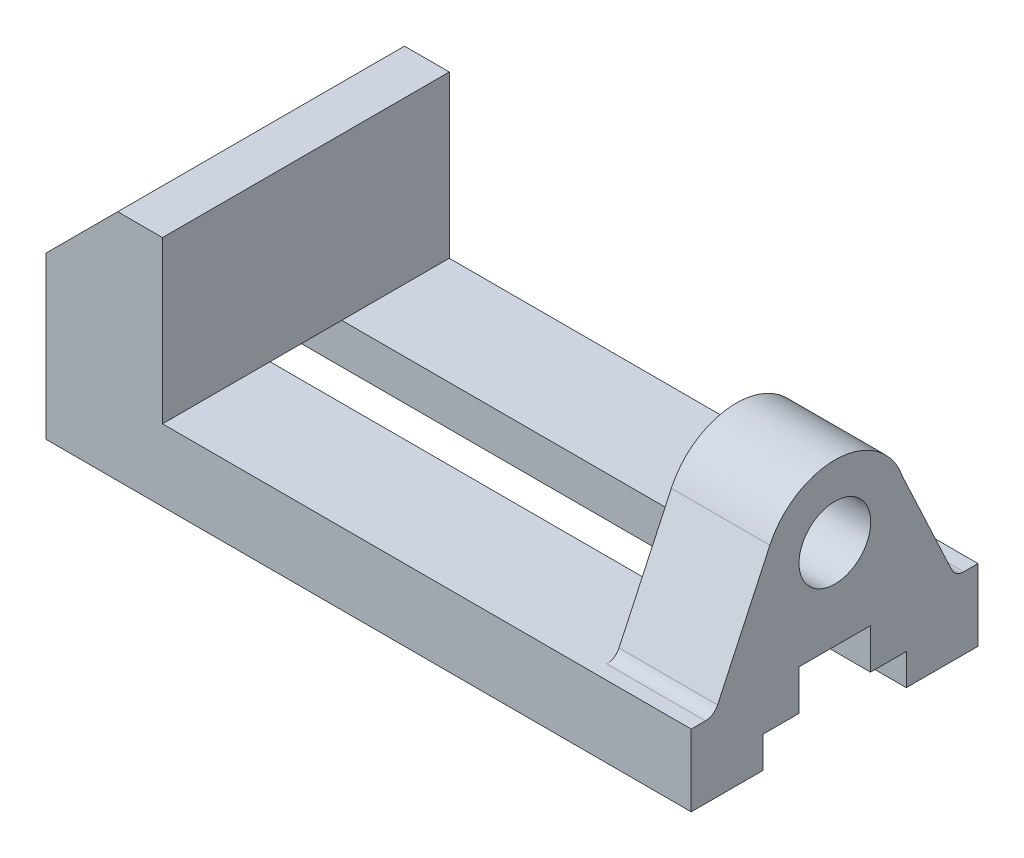
ISO-10303-21;
HEADER;
FILE_DESCRIPTION(('STEP AP214'),'2;1');
FILE_NAME('part.step','',(''),(''),'','','');
FILE_SCHEMA(('AUTOMOTIVE_DESIGN { 1 0 10303 214 1 1 1 1 }'));
ENDSEC;
DATA;
#1=APPLICATION_CONTEXT('core data for automotive mechanical design processes');
#2=APPLICATION_PROTOCOL_DEFINITION('international standard','automotive_design',2000,#1);
#3=PRODUCT_CONTEXT('',#1,'mechanical');
#4=PRODUCT('Part','Part','',(#3));
#5=PRODUCT_RELATED_PRODUCT_CATEGORY('part','',(#4));
#6=PRODUCT_DEFINITION_FORMATION('','',#4);
#7=PRODUCT_DEFINITION_CONTEXT('part definition',#1,'design');
#8=PRODUCT_DEFINITION('design','',#6,#7);
#9=PRODUCT_DEFINITION_SHAPE('','',#8);
#10=(LENGTH_UNIT() NAMED_UNIT(*) SI_UNIT(.MILLI.,.METRE.));
#11=(NAMED_UNIT(*) PLANE_ANGLE_UNIT() SI_UNIT($,.RADIAN.));
#12=(NAMED_UNIT(*) SI_UNIT($,.STERADIAN.) SOLID_ANGLE_UNIT());
#13=UNCERTAINTY_MEASURE_WITH_UNIT(LENGTH_MEASURE(1.E-05),#10,'distance_accuracy_value','');
#14=(GEOMETRIC_REPRESENTATION_CONTEXT(3) GLOBAL_UNCERTAINTY_ASSIGNED_CONTEXT((#13)) GLOBAL_UNIT_ASSIGNED_CONTEXT((#10,
#11,#12)) REPRESENTATION_CONTEXT('',''));
#15=CARTESIAN_POINT('',(0.,0.,0.));
#16=DIRECTION('',(0.,0.,1.));
#17=DIRECTION('',(1.,0.,0.));
#18=AXIS2_PLACEMENT_3D('',#15,#16,#17);
#19=CARTESIAN_POINT('',(26.,16.,32.));
#20=DIRECTION('',(0.,-1.,0.));
#21=DIRECTION('',(1.,0.,0.));
#22=AXIS2_PLACEMENT_3D('',#19,#20,#21);
#23=PLANE('',#22);
#24=DIRECTION('',(0.,0.,1.));
#25=VECTOR('',#24,1.);
#26=CARTESIAN_POINT('',(122.,16.,-26.927127131609));
#27=LINE('',#26,#25);
#28=CARTESIAN_POINT('',(122.,16.,7.99999999999999));
#29=VERTEX_POINT('',#28);
#30=CARTESIAN_POINT('',(122.,16.,28.8383379140315));
#31=VERTEX_POINT('',#30);
#32=EDGE_CURVE('E347',#29,#31,#27,.T.);
#33=ORIENTED_EDGE('',*,*,#32,.F.);
#34=DIRECTION('',(1.,0.,0.));
#35=VECTOR('',#34,1.);
#36=CARTESIAN_POINT('',(0.,16.,8.));
#37=LINE('',#36,#35);
#38=CARTESIAN_POINT('',(26.,16.,8.));
#39=VERTEX_POINT('',#38);
#40=EDGE_CURVE('E67',#39,#29,#37,.T.);
#41=ORIENTED_EDGE('',*,*,#40,.F.);
#42=DIRECTION('',(0.,0.,-1.));
#43=VECTOR('',#42,1.);
#44=CARTESIAN_POINT('',(26.,16.,32.));
#45=LINE('',#44,#43);
#46=CARTESIAN_POINT('',(26.,16.,32.));
#47=VERTEX_POINT('',#46);
#48=EDGE_CURVE('E441',#47,#39,#45,.T.);
#49=ORIENTED_EDGE('',*,*,#48,.F.);
#50=DIRECTION('',(-1.,0.,0.));
#51=VECTOR('',#50,1.);
#52=CARTESIAN_POINT('',(26.,16.,32.));
#53=LINE('',#52,#51);
#54=CARTESIAN_POINT('',(144.,16.,32.));
#55=VERTEX_POINT('',#54);
#56=EDGE_CURVE('E385',#55,#47,#53,.T.);
#57=ORIENTED_EDGE('',*,*,#56,.F.);
#58=DIRECTION('',(0.,0.,-1.));
#59=VECTOR('',#58,1.);
#60=CARTESIAN_POINT('',(144.,16.,32.));
#61=LINE('',#60,#59);
#62=CARTESIAN_POINT('',(144.,16.,28.8383379140315));
#63=VERTEX_POINT('',#62);
#64=EDGE_CURVE('E446',#55,#63,#61,.T.);
#65=ORIENTED_EDGE('',*,*,#64,.T.);
#66=DIRECTION('',(1.,0.,0.));
#67=VECTOR('',#66,1.);
#68=CARTESIAN_POINT('',(122.,16.,28.8383379140315));
#69=LINE('',#68,#67);
#70=EDGE_CURVE('E459',#63,#31,#69,.F.);
#71=ORIENTED_EDGE('',*,*,#70,.T.);
#72=EDGE_LOOP('',(#33,#41,#49,#57,#65,#71));
#73=FACE_BOUND('',#72,.T.);
#74=ADVANCED_FACE('F43',(#73),#23,.F.);
#75=CARTESIAN_POINT('',(144.,0.,32.));
#76=DIRECTION('',(0.,1.,0.));
#77=DIRECTION('',(-1.,0.,0.));
#78=AXIS2_PLACEMENT_3D('',#75,#76,#77);
#79=PLANE('',#78);
#80=CARTESIAN_POINT('',(36.,0.,22.));
#81=DIRECTION('',(0.,-1.,0.));
#82=DIRECTION('',(0.,0.,-1.));
#83=AXIS2_PLACEMENT_3D('',#80,#81,#82);
#84=CIRCLE('',#83,2.99999999999999);
#85=CARTESIAN_POINT('',(36.,0.,19.));
#86=VERTEX_POINT('',#85);
#87=EDGE_CURVE('E222',#86,#86,#84,.T.);
#88=ORIENTED_EDGE('',*,*,#87,.F.);
#89=EDGE_LOOP('',(#88));
#90=FACE_BOUND('',#89,.T.);
#91=CARTESIAN_POINT('',(106.,0.,22.));
#92=DIRECTION('',(0.,-1.,0.));
#93=DIRECTION('',(0.,0.,-1.));
#94=AXIS2_PLACEMENT_3D('',#91,#92,#93);
#95=CIRCLE('',#94,2.99999999999999);
#96=CARTESIAN_POINT('',(106.,0.,19.));
#97=VERTEX_POINT('',#96);
#98=EDGE_CURVE('E244',#97,#97,#95,.T.);
#99=ORIENTED_EDGE('',*,*,#98,.F.);
#100=EDGE_LOOP('',(#99));
#101=FACE_BOUND('',#100,.T.);
#102=DIRECTION('',(0.,0.,-1.));
#103=VECTOR('',#102,1.);
#104=CARTESIAN_POINT('',(0.,0.,32.));
#105=LINE('',#104,#103);
#106=CARTESIAN_POINT('',(0.,0.,32.));
#107=VERTEX_POINT('',#106);
#108=CARTESIAN_POINT('',(0.,0.,16.));
#109=VERTEX_POINT('',#108);
#110=EDGE_CURVE('E424',#107,#109,#105,.T.);
#111=ORIENTED_EDGE('',*,*,#110,.T.);
#112=DIRECTION('',(1.,0.,0.));
#113=VECTOR('',#112,1.);
#114=CARTESIAN_POINT('',(144.,0.,16.));
#115=LINE('',#114,#113);
#116=CARTESIAN_POINT('',(144.,0.,16.));
#117=VERTEX_POINT('',#116);
#118=EDGE_CURVE('E330',#109,#117,#115,.T.);
#119=ORIENTED_EDGE('',*,*,#118,.T.);
#120=DIRECTION('',(0.,0.,-1.));
#121=VECTOR('',#120,1.);
#122=CARTESIAN_POINT('',(144.,0.,32.));
#123=LINE('',#122,#121);
#124=CARTESIAN_POINT('',(144.,0.,32.));
#125=VERTEX_POINT('',#124);
#126=EDGE_CURVE('E451',#125,#117,#123,.T.);
#127=ORIENTED_EDGE('',*,*,#126,.F.);
#128=DIRECTION('',(1.,0.,0.));
#129=VECTOR('',#128,1.);
#130=CARTESIAN_POINT('',(144.,0.,32.));
#131=LINE('',#130,#129);
#132=EDGE_CURVE('E377',#107,#125,#131,.T.);
#133=ORIENTED_EDGE('',*,*,#132,.F.);
#134=EDGE_LOOP('',(#111,#119,#127,#133));
#135=FACE_BOUND('',#134,.T.);
#136=ADVANCED_FACE('F547',(#90,#101,#135),#79,.F.);
#137=CARTESIAN_POINT('',(26.,16.,-8.));
#138=VERTEX_POINT('',#137);
#139=CARTESIAN_POINT('',(26.,16.,-32.));
#140=VERTEX_POINT('',#139);
#141=EDGE_CURVE('E440',#138,#140,#45,.T.);
#142=ORIENTED_EDGE('',*,*,#141,.F.);
#143=DIRECTION('',(1.,0.,0.));
#144=VECTOR('',#143,1.);
#145=CARTESIAN_POINT('',(0.,16.,-8.));
#146=LINE('',#145,#144);
#147=CARTESIAN_POINT('',(122.,16.,-8.));
#148=VERTEX_POINT('',#147);
#149=EDGE_CURVE('E316',#138,#148,#146,.T.);
#150=ORIENTED_EDGE('',*,*,#149,.T.);
#151=CARTESIAN_POINT('',(122.,16.,-28.8383379140315));
#152=VERTEX_POINT('',#151);
#153=EDGE_CURVE('E349',#152,#148,#27,.T.);
#154=ORIENTED_EDGE('',*,*,#153,.F.);
#155=DIRECTION('',(1.,0.,0.));
#156=VECTOR('',#155,1.);
#157=CARTESIAN_POINT('',(144.,16.,-28.8383379140315));
#158=LINE('',#157,#156);
#159=CARTESIAN_POINT('',(144.,16.,-28.8383379140315));
#160=VERTEX_POINT('',#159);
#161=EDGE_CURVE('E469',#152,#160,#158,.T.);
#162=ORIENTED_EDGE('',*,*,#161,.T.);
#163=CARTESIAN_POINT('',(144.,16.,-32.));
#164=VERTEX_POINT('',#163);
#165=EDGE_CURVE('E445',#160,#164,#61,.T.);
#166=ORIENTED_EDGE('',*,*,#165,.T.);
#167=DIRECTION('',(-1.,0.,0.));
#168=VECTOR('',#167,1.);
#169=CARTESIAN_POINT('',(26.,16.,-32.));
#170=LINE('',#169,#168);
#171=EDGE_CURVE('E408',#164,#140,#170,.T.);
#172=ORIENTED_EDGE('',*,*,#171,.T.);
#173=EDGE_LOOP('',(#142,#150,#154,#162,#166,#172));
#174=FACE_BOUND('',#173,.T.);
#175=ADVANCED_FACE('F491',(#174),#23,.F.);
#176=CARTESIAN_POINT('',(36.,0.,-22.));
#177=DIRECTION('',(0.,-1.,0.));
#178=DIRECTION('',(0.,0.,-1.));
#179=AXIS2_PLACEMENT_3D('',#176,#177,#178);
#180=CIRCLE('',#179,2.99999999999999);
#181=CARTESIAN_POINT('',(36.,0.,-25.));
#182=VERTEX_POINT('',#181);
#183=EDGE_CURVE('E223',#182,#182,#180,.T.);
#184=ORIENTED_EDGE('',*,*,#183,.F.);
#185=EDGE_LOOP('',(#184));
#186=FACE_BOUND('',#185,.T.);
#187=CARTESIAN_POINT('',(106.,0.,-22.));
#188=DIRECTION('',(0.,-1.,0.));
#189=DIRECTION('',(0.,0.,-1.));
#190=AXIS2_PLACEMENT_3D('',#187,#188,#189);
#191=CIRCLE('',#190,2.99999999999999);
#192=CARTESIAN_POINT('',(106.,0.,-25.));
#193=VERTEX_POINT('',#192);
#194=EDGE_CURVE('E236',#193,#193,#191,.T.);
#195=ORIENTED_EDGE('',*,*,#194,.F.);
#196=EDGE_LOOP('',(#195));
#197=FACE_BOUND('',#196,.T.);
#198=CARTESIAN_POINT('',(144.,0.,-16.));
#199=VERTEX_POINT('',#198);
#200=CARTESIAN_POINT('',(144.,0.,-32.));
#201=VERTEX_POINT('',#200);
#202=EDGE_CURVE('E450',#199,#201,#123,.T.);
#203=ORIENTED_EDGE('',*,*,#202,.F.);
#204=DIRECTION('',(-1.,0.,0.));
#205=VECTOR('',#204,1.);
#206=CARTESIAN_POINT('',(144.,0.,-16.));
#207=LINE('',#206,#205);
#208=CARTESIAN_POINT('',(0.,0.,-16.));
#209=VERTEX_POINT('',#208);
#210=EDGE_CURVE('E326',#199,#209,#207,.T.);
#211=ORIENTED_EDGE('',*,*,#210,.T.);
#212=CARTESIAN_POINT('',(0.,0.,-32.));
#213=VERTEX_POINT('',#212);
#214=EDGE_CURVE('E400',#209,#213,#105,.T.);
#215=ORIENTED_EDGE('',*,*,#214,.T.);
#216=DIRECTION('',(1.,0.,0.));
#217=VECTOR('',#216,1.);
#218=CARTESIAN_POINT('',(144.,0.,-32.));
#219=LINE('',#218,#217);
#220=EDGE_CURVE('E376',#213,#201,#219,.T.);
#221=ORIENTED_EDGE('',*,*,#220,.T.);
#222=EDGE_LOOP('',(#203,#211,#215,#221));
#223=FACE_BOUND('',#222,.T.);
#224=ADVANCED_FACE('F576',(#186,#197,#223),#79,.F.);
#225=CARTESIAN_POINT('',(144.,16.,32.));
#226=DIRECTION('',(-1.,0.,0.));
#227=DIRECTION('',(0.,0.,1.));
#228=AXIS2_PLACEMENT_3D('',#225,#226,#227);
#229=PLANE('',#228);
#230=CARTESIAN_POINT('',(144.,36.,-0.0530727348907658));
#231=DIRECTION('',(1.,0.,0.));
#232=DIRECTION('',(0.,0.,-1.));
#233=AXIS2_PLACEMENT_3D('',#230,#231,#232);
#234=CIRCLE('',#233,8.);
#235=CARTESIAN_POINT('',(144.,36.,-8.05307273489077));
#236=VERTEX_POINT('',#235);
#237=EDGE_CURVE('E334',#236,#236,#234,.T.);
#238=ORIENTED_EDGE('',*,*,#237,.F.);
#239=EDGE_LOOP('',(#238));
#240=FACE_BOUND('',#239,.T.);
#241=ORIENTED_EDGE('',*,*,#126,.T.);
#242=DIRECTION('',(0.,-1.,0.));
#243=VECTOR('',#242,1.);
#244=CARTESIAN_POINT('',(144.,-7.59312526247733,16.));
#245=LINE('',#244,#243);
#246=CARTESIAN_POINT('',(144.,7.,16.));
#247=VERTEX_POINT('',#246);
#248=EDGE_CURVE('E256',#247,#117,#245,.T.);
#249=ORIENTED_EDGE('',*,*,#248,.F.);
#250=DIRECTION('',(0.,0.,1.));
#251=VECTOR('',#250,1.);
#252=CARTESIAN_POINT('',(144.,7.,16.));
#253=LINE('',#252,#251);
#254=CARTESIAN_POINT('',(144.,7.,8.));
#255=VERTEX_POINT('',#254);
#256=EDGE_CURVE('E295',#255,#247,#253,.T.);
#257=ORIENTED_EDGE('',*,*,#256,.F.);
#258=DIRECTION('',(0.,-1.,0.));
#259=VECTOR('',#258,1.);
#260=CARTESIAN_POINT('',(144.,7.,8.));
#261=LINE('',#260,#259);
#262=CARTESIAN_POINT('',(144.,16.,8.));
#263=VERTEX_POINT('',#262);
#264=EDGE_CURVE('E291',#263,#255,#261,.T.);
#265=ORIENTED_EDGE('',*,*,#264,.F.);
#266=DIRECTION('',(0.,0.,1.));
#267=VECTOR('',#266,1.);
#268=CARTESIAN_POINT('',(144.,16.,8.));
#269=LINE('',#268,#267);
#270=CARTESIAN_POINT('',(144.,16.,-8.));
#271=VERTEX_POINT('',#270);
#272=EDGE_CURVE('E287',#271,#263,#269,.T.);
#273=ORIENTED_EDGE('',*,*,#272,.F.);
#274=DIRECTION('',(0.,1.,0.));
#275=VECTOR('',#274,1.);
#276=CARTESIAN_POINT('',(144.,16.,-8.));
#277=LINE('',#276,#275);
#278=CARTESIAN_POINT('',(144.,7.,-8.));
#279=VERTEX_POINT('',#278);
#280=EDGE_CURVE('E283',#279,#271,#277,.T.);
#281=ORIENTED_EDGE('',*,*,#280,.F.);
#282=DIRECTION('',(0.,0.,1.));
#283=VECTOR('',#282,1.);
#284=CARTESIAN_POINT('',(144.,7.,-8.));
#285=LINE('',#284,#283);
#286=CARTESIAN_POINT('',(144.,7.,-16.));
#287=VERTEX_POINT('',#286);
#288=EDGE_CURVE('E279',#287,#279,#285,.T.);
#289=ORIENTED_EDGE('',*,*,#288,.F.);
#290=DIRECTION('',(0.,1.,0.));
#291=VECTOR('',#290,1.);
#292=CARTESIAN_POINT('',(144.,7.,-16.));
#293=LINE('',#292,#291);
#294=EDGE_CURVE('E252',#199,#287,#293,.T.);
#295=ORIENTED_EDGE('',*,*,#294,.F.);
#296=ORIENTED_EDGE('',*,*,#202,.T.);
#297=DIRECTION('',(0.,1.,0.));
#298=VECTOR('',#297,1.);
#299=CARTESIAN_POINT('',(144.,16.,-32.));
#300=LINE('',#299,#298);
#301=EDGE_CURVE('E404',#201,#164,#300,.T.);
#302=ORIENTED_EDGE('',*,*,#301,.T.);
#303=ORIENTED_EDGE('',*,*,#165,.F.);
#304=CARTESIAN_POINT('',(144.,19.,-28.8383379140315));
#305=DIRECTION('',(-1.,0.,0.));
#306=DIRECTION('',(0.,0.,1.));
#307=AXIS2_PLACEMENT_3D('',#304,#305,#306);
#308=CIRCLE('',#307,3.);
#309=CARTESIAN_POINT('',(144.,17.7321452147779,-26.1194145529215));
#310=VERTEX_POINT('',#309);
#311=EDGE_CURVE('E476',#160,#310,#308,.T.);
#312=ORIENTED_EDGE('',*,*,#311,.T.);
#313=DIRECTION('',(0.,-0.906307787036651,-0.422618261740697));
#314=VECTOR('',#313,1.);
#315=CARTESIAN_POINT('',(144.,41.1334737518031,-15.2071958451057));
#316=LINE('',#315,#314);
#317=CARTESIAN_POINT('',(144.,41.1334737518031,-15.2071958451057));
#318=VERTEX_POINT('',#317);
#319=EDGE_CURVE('E339',#318,#310,#316,.T.);
#320=ORIENTED_EDGE('',*,*,#319,.F.);
#321=CARTESIAN_POINT('',(144.,36.,-0.0530727348907658));
#322=DIRECTION('',(-1.,0.,0.));
#323=DIRECTION('',(0.,0.,1.));
#324=AXIS2_PLACEMENT_3D('',#321,#322,#323);
#325=CIRCLE('',#324,16.);
#326=CARTESIAN_POINT('',(144.,42.7618921878511,14.4478518576957));
#327=VERTEX_POINT('',#326);
#328=EDGE_CURVE('E348',#327,#318,#325,.T.);
#329=ORIENTED_EDGE('',*,*,#328,.F.);
#330=DIRECTION('',(0.,0.906307787036651,-0.422618261740697));
#331=VECTOR('',#330,1.);
#332=CARTESIAN_POINT('',(144.,16.,26.927127131609));
#333=LINE('',#332,#331);
#334=CARTESIAN_POINT('',(144.,17.7321452147779,26.1194145529215));
#335=VERTEX_POINT('',#334);
#336=EDGE_CURVE('E364',#335,#327,#333,.T.);
#337=ORIENTED_EDGE('',*,*,#336,.F.);
#338=CARTESIAN_POINT('',(144.,19.,28.8383379140315));
#339=DIRECTION('',(-1.,0.,0.));
#340=DIRECTION('',(0.,0.,1.));
#341=AXIS2_PLACEMENT_3D('',#338,#339,#340);
#342=CIRCLE('',#341,3.);
#343=EDGE_CURVE('E463',#335,#63,#342,.T.);
#344=ORIENTED_EDGE('',*,*,#343,.T.);
#345=ORIENTED_EDGE('',*,*,#64,.F.);
#346=DIRECTION('',(0.,1.,0.));
#347=VECTOR('',#346,1.);
#348=CARTESIAN_POINT('',(144.,16.,32.));
#349=LINE('',#348,#347);
#350=EDGE_CURVE('E381',#125,#55,#349,.T.);
#351=ORIENTED_EDGE('',*,*,#350,.F.);
#352=EDGE_LOOP('',(#241,#249,#257,#265,#273,#281,#289,#295,#296,#302,#303,#312,#320,#329,#337,
#344,#345,#351));
#353=FACE_BOUND('',#352,.T.);
#354=ADVANCED_FACE('F494',(#240,#353),#229,.F.);
#355=CARTESIAN_POINT('',(26.,52.,32.));
#356=DIRECTION('',(-1.,0.,0.));
#357=DIRECTION('',(0.,-1.,0.));
#358=AXIS2_PLACEMENT_3D('',#355,#356,#357);
#359=PLANE('',#358);
#360=DIRECTION('',(0.,1.,0.));
#361=VECTOR('',#360,1.);
#362=CARTESIAN_POINT('',(26.,52.,-32.));
#363=LINE('',#362,#361);
#364=CARTESIAN_POINT('',(26.,52.,-32.));
#365=VERTEX_POINT('',#364);
#366=EDGE_CURVE('E412',#140,#365,#363,.T.);
#367=ORIENTED_EDGE('',*,*,#366,.T.);
#368=DIRECTION('',(0.,0.,-1.));
#369=VECTOR('',#368,1.);
#370=CARTESIAN_POINT('',(26.,52.,32.));
#371=LINE('',#370,#369);
#372=CARTESIAN_POINT('',(26.,52.,32.));
#373=VERTEX_POINT('',#372);
#374=EDGE_CURVE('E436',#373,#365,#371,.T.);
#375=ORIENTED_EDGE('',*,*,#374,.F.);
#376=DIRECTION('',(0.,1.,0.));
#377=VECTOR('',#376,1.);
#378=CARTESIAN_POINT('',(26.,52.,32.));
#379=LINE('',#378,#377);
#380=EDGE_CURVE('E388',#47,#373,#379,.T.);
#381=ORIENTED_EDGE('',*,*,#380,.F.);
#382=ORIENTED_EDGE('',*,*,#48,.T.);
#383=DIRECTION('',(0.,0.,-1.));
#384=VECTOR('',#383,1.);
#385=CARTESIAN_POINT('',(26.,16.,32.));
#386=LINE('',#385,#384);
#387=EDGE_CURVE('E304',#39,#138,#386,.T.);
#388=ORIENTED_EDGE('',*,*,#387,.T.);
#389=ORIENTED_EDGE('',*,*,#141,.T.);
#390=EDGE_LOOP('',(#367,#375,#381,#382,#388,#389));
#391=FACE_BOUND('',#390,.T.);
#392=ADVANCED_FACE('F587',(#391),#359,.F.);
#393=CARTESIAN_POINT('',(16.,52.,32.));
#394=DIRECTION('',(0.,-1.,0.));
#395=DIRECTION('',(0.,0.,-1.));
#396=AXIS2_PLACEMENT_3D('',#393,#394,#395);
#397=PLANE('',#396);
#398=DIRECTION('',(-1.,0.,0.));
#399=VECTOR('',#398,1.);
#400=CARTESIAN_POINT('',(16.,52.,-32.));
#401=LINE('',#400,#399);
#402=CARTESIAN_POINT('',(16.,52.,-32.));
#403=VERTEX_POINT('',#402);
#404=EDGE_CURVE('E415',#365,#403,#401,.T.);
#405=ORIENTED_EDGE('',*,*,#404,.T.);
#406=DIRECTION('',(0.,0.,-1.));
#407=VECTOR('',#406,1.);
#408=CARTESIAN_POINT('',(16.,52.,32.));
#409=LINE('',#408,#407);
#410=CARTESIAN_POINT('',(16.,52.,32.));
#411=VERTEX_POINT('',#410);
#412=EDGE_CURVE('E432',#411,#403,#409,.T.);
#413=ORIENTED_EDGE('',*,*,#412,.F.);
#414=DIRECTION('',(-1.,0.,0.));
#415=VECTOR('',#414,1.);
#416=CARTESIAN_POINT('',(16.,52.,32.));
#417=LINE('',#416,#415);
#418=EDGE_CURVE('E391',#373,#411,#417,.T.);
#419=ORIENTED_EDGE('',*,*,#418,.F.);
#420=ORIENTED_EDGE('',*,*,#374,.T.);
#421=EDGE_LOOP('',(#405,#413,#419,#420));
#422=FACE_BOUND('',#421,.T.);
#423=ADVANCED_FACE('F630',(#422),#397,.F.);
#424=CARTESIAN_POINT('',(0.,36.,32.));
#425=DIRECTION('',(0.707106781186547,-0.707106781186547,0.));
#426=DIRECTION('',(0.707106781186548,0.707106781186548,0.));
#427=AXIS2_PLACEMENT_3D('',#424,#425,#426);
#428=PLANE('',#427);
#429=DIRECTION('',(-0.707106781186548,-0.707106781186548,0.));
#430=VECTOR('',#429,1.);
#431=CARTESIAN_POINT('',(0.,36.,-32.));
#432=LINE('',#431,#430);
#433=CARTESIAN_POINT('',(0.,36.,-32.));
#434=VERTEX_POINT('',#433);
#435=EDGE_CURVE('E418',#403,#434,#432,.T.);
#436=ORIENTED_EDGE('',*,*,#435,.T.);
#437=DIRECTION('',(0.,0.,-1.));
#438=VECTOR('',#437,1.);
#439=CARTESIAN_POINT('',(0.,36.,32.));
#440=LINE('',#439,#438);
#441=CARTESIAN_POINT('',(0.,36.,32.));
#442=VERTEX_POINT('',#441);
#443=EDGE_CURVE('E428',#442,#434,#440,.T.);
#444=ORIENTED_EDGE('',*,*,#443,.F.);
#445=DIRECTION('',(-0.707106781186548,-0.707106781186548,0.));
#446=VECTOR('',#445,1.);
#447=CARTESIAN_POINT('',(0.,36.,32.));
#448=LINE('',#447,#446);
#449=EDGE_CURVE('E394',#411,#442,#448,.T.);
#450=ORIENTED_EDGE('',*,*,#449,.F.);
#451=ORIENTED_EDGE('',*,*,#412,.T.);
#452=EDGE_LOOP('',(#436,#444,#450,#451));
#453=FACE_BOUND('',#452,.T.);
#454=ADVANCED_FACE('F627',(#453),#428,.F.);
#455=CARTESIAN_POINT('',(0.,0.,32.));
#456=DIRECTION('',(1.,0.,0.));
#457=DIRECTION('',(0.,0.,-1.));
#458=AXIS2_PLACEMENT_3D('',#455,#456,#457);
#459=PLANE('',#458);
#460=DIRECTION('',(0.,0.,1.));
#461=VECTOR('',#460,1.);
#462=CARTESIAN_POINT('',(0.,7.,16.));
#463=LINE('',#462,#461);
#464=CARTESIAN_POINT('',(0.,7.,8.));
#465=VERTEX_POINT('',#464);
#466=CARTESIAN_POINT('',(0.,7.,16.));
#467=VERTEX_POINT('',#466);
#468=EDGE_CURVE('E268',#465,#467,#463,.T.);
#469=ORIENTED_EDGE('',*,*,#468,.T.);
#470=DIRECTION('',(0.,-1.,0.));
#471=VECTOR('',#470,1.);
#472=CARTESIAN_POINT('',(0.,-7.59312526247733,16.));
#473=LINE('',#472,#471);
#474=EDGE_CURVE('E272',#467,#109,#473,.T.);
#475=ORIENTED_EDGE('',*,*,#474,.T.);
#476=ORIENTED_EDGE('',*,*,#110,.F.);
#477=DIRECTION('',(0.,-1.,0.));
#478=VECTOR('',#477,1.);
#479=CARTESIAN_POINT('',(0.,0.,32.));
#480=LINE('',#479,#478);
#481=EDGE_CURVE('E397',#442,#107,#480,.T.);
#482=ORIENTED_EDGE('',*,*,#481,.F.);
#483=ORIENTED_EDGE('',*,*,#443,.T.);
#484=DIRECTION('',(0.,-1.,0.));
#485=VECTOR('',#484,1.);
#486=CARTESIAN_POINT('',(0.,0.,-32.));
#487=LINE('',#486,#485);
#488=EDGE_CURVE('E382',#434,#213,#487,.T.);
#489=ORIENTED_EDGE('',*,*,#488,.T.);
#490=ORIENTED_EDGE('',*,*,#214,.F.);
#491=DIRECTION('',(0.,1.,0.));
#492=VECTOR('',#491,1.);
#493=CARTESIAN_POINT('',(0.,0.,-16.));
#494=LINE('',#493,#492);
#495=CARTESIAN_POINT('',(0.,7.,-16.));
#496=VERTEX_POINT('',#495);
#497=EDGE_CURVE('E11',#209,#496,#494,.T.);
#498=ORIENTED_EDGE('',*,*,#497,.T.);
#499=DIRECTION('',(0.,0.,1.));
#500=VECTOR('',#499,1.);
#501=CARTESIAN_POINT('',(0.,7.,-8.));
#502=LINE('',#501,#500);
#503=CARTESIAN_POINT('',(0.,7.,-8.));
#504=VERTEX_POINT('',#503);
#505=EDGE_CURVE('E59',#496,#504,#502,.T.);
#506=ORIENTED_EDGE('',*,*,#505,.T.);
#507=DIRECTION('',(0.,1.,0.));
#508=VECTOR('',#507,1.);
#509=CARTESIAN_POINT('',(0.,16.,-8.));
#510=LINE('',#509,#508);
#511=CARTESIAN_POINT('',(0.,16.,-8.));
#512=VERTEX_POINT('',#511);
#513=EDGE_CURVE('E255',#504,#512,#510,.T.);
#514=ORIENTED_EDGE('',*,*,#513,.T.);
#515=DIRECTION('',(0.,0.,1.));
#516=VECTOR('',#515,1.);
#517=CARTESIAN_POINT('',(0.,16.,8.));
#518=LINE('',#517,#516);
#519=CARTESIAN_POINT('',(0.,16.,8.));
#520=VERTEX_POINT('',#519);
#521=EDGE_CURVE('E260',#512,#520,#518,.T.);
#522=ORIENTED_EDGE('',*,*,#521,.T.);
#523=DIRECTION('',(0.,-1.,0.));
#524=VECTOR('',#523,1.);
#525=CARTESIAN_POINT('',(0.,7.,8.));
#526=LINE('',#525,#524);
#527=EDGE_CURVE('E264',#520,#465,#526,.T.);
#528=ORIENTED_EDGE('',*,*,#527,.T.);
#529=EDGE_LOOP('',(#469,#475,#476,#482,#483,#489,#490,#498,#506,#514,#522,#528));
#530=FACE_BOUND('',#529,.T.);
#531=ADVANCED_FACE('F553',(#530),#459,.F.);
#532=CARTESIAN_POINT('',(0.,0.,32.));
#533=DIRECTION('',(0.,0.,-1.));
#534=DIRECTION('',(-1.,0.,0.));
#535=AXIS2_PLACEMENT_3D('',#532,#533,#534);
#536=PLANE('',#535);
#537=ORIENTED_EDGE('',*,*,#132,.T.);
#538=ORIENTED_EDGE('',*,*,#350,.T.);
#539=ORIENTED_EDGE('',*,*,#56,.T.);
#540=ORIENTED_EDGE('',*,*,#380,.T.);
#541=ORIENTED_EDGE('',*,*,#418,.T.);
#542=ORIENTED_EDGE('',*,*,#449,.T.);
#543=ORIENTED_EDGE('',*,*,#481,.T.);
#544=EDGE_LOOP('',(#537,#538,#539,#540,#541,#542,#543));
#545=FACE_BOUND('',#544,.T.);
#546=ADVANCED_FACE('F542',(#545),#536,.F.);
#547=CARTESIAN_POINT('',(0.,0.,-32.));
#548=DIRECTION('',(0.,0.,-1.));
#549=DIRECTION('',(-1.,0.,0.));
#550=AXIS2_PLACEMENT_3D('',#547,#548,#549);
#551=PLANE('',#550);
#552=ORIENTED_EDGE('',*,*,#220,.F.);
#553=ORIENTED_EDGE('',*,*,#488,.F.);
#554=ORIENTED_EDGE('',*,*,#435,.F.);
#555=ORIENTED_EDGE('',*,*,#404,.F.);
#556=ORIENTED_EDGE('',*,*,#366,.F.);
#557=ORIENTED_EDGE('',*,*,#171,.F.);
#558=ORIENTED_EDGE('',*,*,#301,.F.);
#559=EDGE_LOOP('',(#552,#553,#554,#555,#556,#557,#558));
#560=FACE_BOUND('',#559,.T.);
#561=ADVANCED_FACE('F618',(#560),#551,.T.);
#562=CARTESIAN_POINT('',(122.,41.1334737518031,-15.2071958451057));
#563=DIRECTION('',(0.,-0.422618261740697,0.906307787036651));
#564=DIRECTION('',(0.,-0.906307787036651,-0.422618261740697));
#565=AXIS2_PLACEMENT_3D('',#562,#563,#564);
#566=PLANE('',#565);
#567=ORIENTED_EDGE('',*,*,#319,.T.);
#568=DIRECTION('',(1.,0.,0.));
#569=VECTOR('',#568,1.);
#570=CARTESIAN_POINT('',(122.,17.7321452147779,-26.1194145529215));
#571=LINE('',#570,#569);
#572=CARTESIAN_POINT('',(122.,17.7321452147779,-26.1194145529215));
#573=VERTEX_POINT('',#572);
#574=EDGE_CURVE('E473',#310,#573,#571,.F.);
#575=ORIENTED_EDGE('',*,*,#574,.T.);
#576=DIRECTION('',(0.,-0.906307787036651,-0.422618261740697));
#577=VECTOR('',#576,1.);
#578=CARTESIAN_POINT('',(122.,41.1334737518031,-15.2071958451057));
#579=LINE('',#578,#577);
#580=CARTESIAN_POINT('',(122.,41.1334737518031,-15.2071958451057));
#581=VERTEX_POINT('',#580);
#582=EDGE_CURVE('E343',#581,#573,#579,.T.);
#583=ORIENTED_EDGE('',*,*,#582,.F.);
#584=DIRECTION('',(1.,0.,0.));
#585=VECTOR('',#584,1.);
#586=CARTESIAN_POINT('',(122.,41.1334737518031,-15.2071958451057));
#587=LINE('',#586,#585);
#588=EDGE_CURVE('E360',#581,#318,#587,.T.);
#589=ORIENTED_EDGE('',*,*,#588,.T.);
#590=EDGE_LOOP('',(#567,#575,#583,#589));
#591=FACE_BOUND('',#590,.T.);
#592=ADVANCED_FACE('F615',(#591),#566,.F.);
#593=CARTESIAN_POINT('',(122.,16.,26.927127131609));
#594=DIRECTION('',(0.,-0.422618261740697,-0.906307787036651));
#595=DIRECTION('',(0.,0.906307787036651,-0.422618261740697));
#596=AXIS2_PLACEMENT_3D('',#593,#594,#595);
#597=PLANE('',#596);
#598=DIRECTION('',(0.,0.906307787036651,-0.422618261740697));
#599=VECTOR('',#598,1.);
#600=CARTESIAN_POINT('',(122.,16.,26.927127131609));
#601=LINE('',#600,#599);
#602=CARTESIAN_POINT('',(122.,17.7321452147779,26.1194145529215));
#603=VERTEX_POINT('',#602);
#604=CARTESIAN_POINT('',(122.,42.7618921878511,14.4478518576957));
#605=VERTEX_POINT('',#604);
#606=EDGE_CURVE('E353',#603,#605,#601,.T.);
#607=ORIENTED_EDGE('',*,*,#606,.F.);
#608=DIRECTION('',(1.,0.,0.));
#609=VECTOR('',#608,1.);
#610=CARTESIAN_POINT('',(144.,17.7321452147779,26.1194145529215));
#611=LINE('',#610,#609);
#612=EDGE_CURVE('E455',#603,#335,#611,.T.);
#613=ORIENTED_EDGE('',*,*,#612,.T.);
#614=ORIENTED_EDGE('',*,*,#336,.T.);
#615=DIRECTION('',(1.,0.,0.));
#616=VECTOR('',#615,1.);
#617=CARTESIAN_POINT('',(122.,42.7618921878511,14.4478518576957));
#618=LINE('',#617,#616);
#619=EDGE_CURVE('E372',#605,#327,#618,.T.);
#620=ORIENTED_EDGE('',*,*,#619,.F.);
#621=EDGE_LOOP('',(#607,#613,#614,#620));
#622=FACE_BOUND('',#621,.T.);
#623=ADVANCED_FACE('F533',(#622),#597,.F.);
#624=CARTESIAN_POINT('',(122.,36.,-0.0530727348907658));
#625=DIRECTION('',(1.,0.,0.));
#626=DIRECTION('',(0.,0.,-1.));
#627=AXIS2_PLACEMENT_3D('',#624,#625,#626);
#628=CYLINDRICAL_SURFACE('',#627,16.);
#629=ORIENTED_EDGE('',*,*,#328,.T.);
#630=ORIENTED_EDGE('',*,*,#588,.F.);
#631=CARTESIAN_POINT('',(122.,36.,-0.0530727348907658));
#632=DIRECTION('',(-1.,0.,0.));
#633=DIRECTION('',(0.,0.,1.));
#634=AXIS2_PLACEMENT_3D('',#631,#632,#633);
#635=CIRCLE('',#634,16.);
#636=EDGE_CURVE('E357',#605,#581,#635,.T.);
#637=ORIENTED_EDGE('',*,*,#636,.F.);
#638=ORIENTED_EDGE('',*,*,#619,.T.);
#639=EDGE_LOOP('',(#629,#630,#637,#638));
#640=FACE_BOUND('',#639,.T.);
#641=ADVANCED_FACE('F602',(#640),#628,.T.);
#642=CARTESIAN_POINT('',(122.,36.,-0.0530727348907658));
#643=DIRECTION('',(-1.,0.,0.));
#644=DIRECTION('',(0.,0.,1.));
#645=AXIS2_PLACEMENT_3D('',#642,#643,#644);
#646=PLANE('',#645);
#647=CARTESIAN_POINT('',(122.,36.,-0.0530727348907658));
#648=DIRECTION('',(1.,0.,0.));
#649=DIRECTION('',(0.,0.,-1.));
#650=AXIS2_PLACEMENT_3D('',#647,#648,#649);
#651=CIRCLE('',#650,8.);
#652=CARTESIAN_POINT('',(122.,36.,-8.05307273489077));
#653=VERTEX_POINT('',#652);
#654=EDGE_CURVE('E335',#653,#653,#651,.T.);
#655=ORIENTED_EDGE('',*,*,#654,.T.);
#656=EDGE_LOOP('',(#655));
#657=FACE_BOUND('',#656,.T.);
#658=ORIENTED_EDGE('',*,*,#582,.T.);
#659=CARTESIAN_POINT('',(122.,19.,-28.8383379140315));
#660=DIRECTION('',(-1.,0.,0.));
#661=DIRECTION('',(0.,0.,1.));
#662=AXIS2_PLACEMENT_3D('',#659,#660,#661);
#663=CIRCLE('',#662,3.);
#664=EDGE_CURVE('E52',#573,#152,#663,.F.);
#665=ORIENTED_EDGE('',*,*,#664,.T.);
#666=ORIENTED_EDGE('',*,*,#153,.T.);
#667=EDGE_CURVE('E354',#148,#29,#27,.T.);
#668=ORIENTED_EDGE('',*,*,#667,.T.);
#669=ORIENTED_EDGE('',*,*,#32,.T.);
#670=CARTESIAN_POINT('',(122.,19.,28.8383379140315));
#671=DIRECTION('',(-1.,0.,0.));
#672=DIRECTION('',(0.,0.,1.));
#673=AXIS2_PLACEMENT_3D('',#670,#671,#672);
#674=CIRCLE('',#673,3.);
#675=EDGE_CURVE('E466',#31,#603,#674,.F.);
#676=ORIENTED_EDGE('',*,*,#675,.T.);
#677=ORIENTED_EDGE('',*,*,#606,.T.);
#678=ORIENTED_EDGE('',*,*,#636,.T.);
#679=EDGE_LOOP('',(#658,#665,#666,#668,#669,#676,#677,#678));
#680=FACE_BOUND('',#679,.T.);
#681=ADVANCED_FACE('F483',(#657,#680),#646,.T.);
#682=CARTESIAN_POINT('',(122.,36.,-0.0530727348907658));
#683=DIRECTION('',(1.,0.,0.));
#684=DIRECTION('',(0.,0.,-1.));
#685=AXIS2_PLACEMENT_3D('',#682,#683,#684);
#686=CYLINDRICAL_SURFACE('',#685,8.);
#687=ORIENTED_EDGE('',*,*,#654,.F.);
#688=EDGE_LOOP('',(#687));
#689=FACE_BOUND('',#688,.T.);
#690=ORIENTED_EDGE('',*,*,#237,.T.);
#691=EDGE_LOOP('',(#690));
#692=FACE_BOUND('',#691,.T.);
#693=ADVANCED_FACE('F592',(#689,#692),#686,.F.);
#694=CARTESIAN_POINT('',(122.,19.,28.8383379140315));
#695=DIRECTION('',(-1.,0.,0.));
#696=DIRECTION('',(0.,-1.,0.));
#697=AXIS2_PLACEMENT_3D('',#694,#695,#696);
#698=CYLINDRICAL_SURFACE('',#697,3.);
#699=ORIENTED_EDGE('',*,*,#675,.F.);
#700=ORIENTED_EDGE('',*,*,#70,.F.);
#701=ORIENTED_EDGE('',*,*,#343,.F.);
#702=ORIENTED_EDGE('',*,*,#612,.F.);
#703=EDGE_LOOP('',(#699,#700,#701,#702));
#704=FACE_BOUND('',#703,.T.);
#705=ADVANCED_FACE('F536',(#704),#698,.F.);
#706=CARTESIAN_POINT('',(26.,19.,-28.8383379140315));
#707=DIRECTION('',(-1.,0.,0.));
#708=DIRECTION('',(0.,-1.,0.));
#709=AXIS2_PLACEMENT_3D('',#706,#707,#708);
#710=CYLINDRICAL_SURFACE('',#709,3.);
#711=ORIENTED_EDGE('',*,*,#664,.F.);
#712=ORIENTED_EDGE('',*,*,#574,.F.);
#713=ORIENTED_EDGE('',*,*,#311,.F.);
#714=ORIENTED_EDGE('',*,*,#161,.F.);
#715=EDGE_LOOP('',(#711,#712,#713,#714));
#716=FACE_BOUND('',#715,.T.);
#717=ADVANCED_FACE('F45',(#716),#710,.F.);
#718=CARTESIAN_POINT('',(0.,-7.59312526247733,16.));
#719=DIRECTION('',(0.,0.,1.));
#720=DIRECTION('',(1.,0.,0.));
#721=AXIS2_PLACEMENT_3D('',#718,#719,#720);
#722=PLANE('',#721);
#723=ORIENTED_EDGE('',*,*,#474,.F.);
#724=DIRECTION('',(1.,0.,0.));
#725=VECTOR('',#724,1.);
#726=CARTESIAN_POINT('',(0.,7.,16.));
#727=LINE('',#726,#725);
#728=EDGE_CURVE('E301',#467,#247,#727,.T.);
#729=ORIENTED_EDGE('',*,*,#728,.T.);
#730=ORIENTED_EDGE('',*,*,#248,.T.);
#731=ORIENTED_EDGE('',*,*,#118,.F.);
#732=EDGE_LOOP('',(#723,#729,#730,#731));
#733=FACE_BOUND('',#732,.T.);
#734=ADVANCED_FACE('F551',(#733),#722,.F.);
#735=CARTESIAN_POINT('',(0.,7.,-16.));
#736=DIRECTION('',(0.,0.,-1.));
#737=DIRECTION('',(-1.,0.,0.));
#738=AXIS2_PLACEMENT_3D('',#735,#736,#737);
#739=PLANE('',#738);
#740=ORIENTED_EDGE('',*,*,#294,.T.);
#741=DIRECTION('',(1.,0.,0.));
#742=VECTOR('',#741,1.);
#743=CARTESIAN_POINT('',(0.,7.,-16.));
#744=LINE('',#743,#742);
#745=EDGE_CURVE('E276',#496,#287,#744,.T.);
#746=ORIENTED_EDGE('',*,*,#745,.F.);
#747=ORIENTED_EDGE('',*,*,#497,.F.);
#748=ORIENTED_EDGE('',*,*,#210,.F.);
#749=EDGE_LOOP('',(#740,#746,#747,#748));
#750=FACE_BOUND('',#749,.T.);
#751=ADVANCED_FACE('F565',(#750),#739,.F.);
#752=CARTESIAN_POINT('',(0.,16.,8.));
#753=DIRECTION('',(0.,1.,0.));
#754=DIRECTION('',(0.,0.,1.));
#755=AXIS2_PLACEMENT_3D('',#752,#753,#754);
#756=PLANE('',#755);
#757=EDGE_CURVE('E308',#520,#39,#37,.T.);
#758=ORIENTED_EDGE('',*,*,#757,.F.);
#759=ORIENTED_EDGE('',*,*,#521,.F.);
#760=EDGE_CURVE('E312',#512,#138,#146,.T.);
#761=ORIENTED_EDGE('',*,*,#760,.T.);
#762=ORIENTED_EDGE('',*,*,#387,.F.);
#763=EDGE_LOOP('',(#758,#759,#761,#762));
#764=FACE_BOUND('',#763,.T.);
#765=ADVANCED_FACE('F558',(#764),#756,.F.);
#766=CARTESIAN_POINT('',(0.,7.,16.));
#767=DIRECTION('',(0.,1.,0.));
#768=DIRECTION('',(0.,0.,1.));
#769=AXIS2_PLACEMENT_3D('',#766,#767,#768);
#770=PLANE('',#769);
#771=ORIENTED_EDGE('',*,*,#256,.T.);
#772=ORIENTED_EDGE('',*,*,#728,.F.);
#773=ORIENTED_EDGE('',*,*,#468,.F.);
#774=DIRECTION('',(1.,0.,0.));
#775=VECTOR('',#774,1.);
#776=CARTESIAN_POINT('',(0.,7.,8.));
#777=LINE('',#776,#775);
#778=EDGE_CURVE('E305',#465,#255,#777,.T.);
#779=ORIENTED_EDGE('',*,*,#778,.T.);
#780=EDGE_LOOP('',(#771,#772,#773,#779));
#781=FACE_BOUND('',#780,.T.);
#782=ADVANCED_FACE('F556',(#781),#770,.F.);
#783=CARTESIAN_POINT('',(0.,7.,8.));
#784=DIRECTION('',(0.,0.,1.));
#785=DIRECTION('',(1.,0.,0.));
#786=AXIS2_PLACEMENT_3D('',#783,#784,#785);
#787=PLANE('',#786);
#788=ORIENTED_EDGE('',*,*,#264,.T.);
#789=ORIENTED_EDGE('',*,*,#778,.F.);
#790=ORIENTED_EDGE('',*,*,#527,.F.);
#791=ORIENTED_EDGE('',*,*,#757,.T.);
#792=ORIENTED_EDGE('',*,*,#40,.T.);
#793=EDGE_CURVE('E311',#29,#263,#37,.T.);
#794=ORIENTED_EDGE('',*,*,#793,.T.);
#795=EDGE_LOOP('',(#788,#789,#790,#791,#792,#794));
#796=FACE_BOUND('',#795,.T.);
#797=ADVANCED_FACE('F520',(#796),#787,.F.);
#798=ORIENTED_EDGE('',*,*,#667,.F.);
#799=EDGE_CURVE('E317',#148,#271,#146,.T.);
#800=ORIENTED_EDGE('',*,*,#799,.T.);
#801=ORIENTED_EDGE('',*,*,#272,.T.);
#802=ORIENTED_EDGE('',*,*,#793,.F.);
#803=EDGE_LOOP('',(#798,#800,#801,#802));
#804=FACE_BOUND('',#803,.T.);
#805=ADVANCED_FACE('F510',(#804),#756,.F.);
#806=CARTESIAN_POINT('',(0.,16.,-8.));
#807=DIRECTION('',(0.,0.,-1.));
#808=DIRECTION('',(-1.,0.,0.));
#809=AXIS2_PLACEMENT_3D('',#806,#807,#808);
#810=PLANE('',#809);
#811=ORIENTED_EDGE('',*,*,#280,.T.);
#812=ORIENTED_EDGE('',*,*,#799,.F.);
#813=ORIENTED_EDGE('',*,*,#149,.F.);
#814=ORIENTED_EDGE('',*,*,#760,.F.);
#815=ORIENTED_EDGE('',*,*,#513,.F.);
#816=DIRECTION('',(1.,0.,0.));
#817=VECTOR('',#816,1.);
#818=CARTESIAN_POINT('',(0.,7.,-8.));
#819=LINE('',#818,#817);
#820=EDGE_CURVE('E318',#504,#279,#819,.T.);
#821=ORIENTED_EDGE('',*,*,#820,.T.);
#822=EDGE_LOOP('',(#811,#812,#813,#814,#815,#821));
#823=FACE_BOUND('',#822,.T.);
#824=ADVANCED_FACE('F515',(#823),#810,.F.);
#825=CARTESIAN_POINT('',(0.,7.,-8.));
#826=DIRECTION('',(0.,1.,0.));
#827=DIRECTION('',(0.,0.,1.));
#828=AXIS2_PLACEMENT_3D('',#825,#826,#827);
#829=PLANE('',#828);
#830=ORIENTED_EDGE('',*,*,#288,.T.);
#831=ORIENTED_EDGE('',*,*,#820,.F.);
#832=ORIENTED_EDGE('',*,*,#505,.F.);
#833=ORIENTED_EDGE('',*,*,#745,.T.);
#834=EDGE_LOOP('',(#830,#831,#832,#833));
#835=FACE_BOUND('',#834,.T.);
#836=ADVANCED_FACE('F652',(#835),#829,.F.);
#837=CARTESIAN_POINT('',(106.,10.,22.));
#838=DIRECTION('',(0.,-1.,0.));
#839=DIRECTION('',(0.,0.,-1.));
#840=AXIS2_PLACEMENT_3D('',#837,#838,#839);
#841=CONICAL_SURFACE('',#840,2.99999999999999,1.04719755119659);
#842=CARTESIAN_POINT('',(106.,11.7320508075689,22.));
#843=VERTEX_POINT('',#842);
#844=VERTEX_LOOP('',#843);
#845=FACE_BOUND('',#844,.T.);
#846=CARTESIAN_POINT('',(106.,10.,22.));
#847=DIRECTION('',(0.,-1.,0.));
#848=DIRECTION('',(0.,0.,-1.));
#849=AXIS2_PLACEMENT_3D('',#846,#847,#848);
#850=CIRCLE('',#849,2.99999999999999);
#851=CARTESIAN_POINT('',(106.,10.,19.));
#852=VERTEX_POINT('',#851);
#853=EDGE_CURVE('E248',#852,#852,#850,.T.);
#854=ORIENTED_EDGE('',*,*,#853,.T.);
#855=EDGE_LOOP('',(#854));
#856=FACE_BOUND('',#855,.T.);
#857=ADVANCED_FACE('F655',(#845,#856),#841,.F.);
#858=CARTESIAN_POINT('',(106.,0.,22.));
#859=DIRECTION('',(0.,-1.,0.));
#860=DIRECTION('',(0.,0.,-1.));
#861=AXIS2_PLACEMENT_3D('',#858,#859,#860);
#862=CYLINDRICAL_SURFACE('',#861,2.99999999999999);
#863=ORIENTED_EDGE('',*,*,#853,.F.);
#864=EDGE_LOOP('',(#863));
#865=FACE_BOUND('',#864,.T.);
#866=ORIENTED_EDGE('',*,*,#98,.T.);
#867=EDGE_LOOP('',(#866));
#868=FACE_BOUND('',#867,.T.);
#869=ADVANCED_FACE('F660',(#865,#868),#862,.F.);
#870=CARTESIAN_POINT('',(106.,10.,-22.));
#871=DIRECTION('',(0.,-1.,0.));
#872=DIRECTION('',(0.,0.,-1.));
#873=AXIS2_PLACEMENT_3D('',#870,#871,#872);
#874=CONICAL_SURFACE('',#873,2.99999999999999,1.04719755119659);
#875=CARTESIAN_POINT('',(106.,11.7320508075689,-22.));
#876=VERTEX_POINT('',#875);
#877=VERTEX_LOOP('',#876);
#878=FACE_BOUND('',#877,.T.);
#879=CARTESIAN_POINT('',(106.,10.,-22.));
#880=DIRECTION('',(0.,-1.,0.));
#881=DIRECTION('',(0.,0.,-1.));
#882=AXIS2_PLACEMENT_3D('',#879,#880,#881);
#883=CIRCLE('',#882,2.99999999999999);
#884=CARTESIAN_POINT('',(106.,10.,-25.));
#885=VERTEX_POINT('',#884);
#886=EDGE_CURVE('E240',#885,#885,#883,.T.);
#887=ORIENTED_EDGE('',*,*,#886,.T.);
#888=EDGE_LOOP('',(#887));
#889=FACE_BOUND('',#888,.T.);
#890=ADVANCED_FACE('F695',(#878,#889),#874,.F.);
#891=CARTESIAN_POINT('',(106.,0.,-22.));
#892=DIRECTION('',(0.,-1.,0.));
#893=DIRECTION('',(0.,0.,-1.));
#894=AXIS2_PLACEMENT_3D('',#891,#892,#893);
#895=CYLINDRICAL_SURFACE('',#894,2.99999999999999);
#896=ORIENTED_EDGE('',*,*,#886,.F.);
#897=EDGE_LOOP('',(#896));
#898=FACE_BOUND('',#897,.T.);
#899=ORIENTED_EDGE('',*,*,#194,.T.);
#900=EDGE_LOOP('',(#899));
#901=FACE_BOUND('',#900,.T.);
#902=ADVANCED_FACE('F720',(#898,#901),#895,.F.);
#903=CARTESIAN_POINT('',(36.,10.,22.));
#904=DIRECTION('',(0.,-1.,0.));
#905=DIRECTION('',(0.,0.,-1.));
#906=AXIS2_PLACEMENT_3D('',#903,#904,#905);
#907=CONICAL_SURFACE('',#906,2.99999999999999,1.04719755119659);
#908=CARTESIAN_POINT('',(36.,11.7320508075689,22.));
#909=VERTEX_POINT('',#908);
#910=VERTEX_LOOP('',#909);
#911=FACE_BOUND('',#910,.T.);
#912=CARTESIAN_POINT('',(36.,10.,22.));
#913=DIRECTION('',(0.,-1.,0.));
#914=DIRECTION('',(0.,0.,-1.));
#915=AXIS2_PLACEMENT_3D('',#912,#913,#914);
#916=CIRCLE('',#915,2.99999999999999);
#917=CARTESIAN_POINT('',(36.,10.,19.));
#918=VERTEX_POINT('',#917);
#919=EDGE_CURVE('E228',#918,#918,#916,.T.);
#920=ORIENTED_EDGE('',*,*,#919,.T.);
#921=EDGE_LOOP('',(#920));
#922=FACE_BOUND('',#921,.T.);
#923=ADVANCED_FACE('F731',(#911,#922),#907,.F.);
#924=CARTESIAN_POINT('',(36.,0.,22.));
#925=DIRECTION('',(0.,-1.,0.));
#926=DIRECTION('',(0.,0.,-1.));
#927=AXIS2_PLACEMENT_3D('',#924,#925,#926);
#928=CYLINDRICAL_SURFACE('',#927,2.99999999999999);
#929=ORIENTED_EDGE('',*,*,#919,.F.);
#930=EDGE_LOOP('',(#929));
#931=FACE_BOUND('',#930,.T.);
#932=ORIENTED_EDGE('',*,*,#87,.T.);
#933=EDGE_LOOP('',(#932));
#934=FACE_BOUND('',#933,.T.);
#935=ADVANCED_FACE('F215',(#931,#934),#928,.F.);
#936=CARTESIAN_POINT('',(36.,9.99999999999999,-22.));
#937=DIRECTION('',(0.,-1.,0.));
#938=DIRECTION('',(0.,0.,-1.));
#939=AXIS2_PLACEMENT_3D('',#936,#937,#938);
#940=CONICAL_SURFACE('',#939,2.99999999999999,1.04719755119659);
#941=CARTESIAN_POINT('',(36.,11.7320508075689,-22.));
#942=VERTEX_POINT('',#941);
#943=VERTEX_LOOP('',#942);
#944=FACE_BOUND('',#943,.T.);
#945=CARTESIAN_POINT('',(36.,9.99999999999999,-22.));
#946=DIRECTION('',(0.,-1.,0.));
#947=DIRECTION('',(0.,0.,-1.));
#948=AXIS2_PLACEMENT_3D('',#945,#946,#947);
#949=CIRCLE('',#948,2.99999999999999);
#950=CARTESIAN_POINT('',(36.,9.99999999999999,-25.));
#951=VERTEX_POINT('',#950);
#952=EDGE_CURVE('E219',#951,#951,#949,.T.);
#953=ORIENTED_EDGE('',*,*,#952,.T.);
#954=EDGE_LOOP('',(#953));
#955=FACE_BOUND('',#954,.T.);
#956=ADVANCED_FACE('F211',(#944,#955),#940,.F.);
#957=CARTESIAN_POINT('',(36.,0.,-22.));
#958=DIRECTION('',(0.,-1.,0.));
#959=DIRECTION('',(0.,0.,-1.));
#960=AXIS2_PLACEMENT_3D('',#957,#958,#959);
#961=CYLINDRICAL_SURFACE('',#960,2.99999999999999);
#962=ORIENTED_EDGE('',*,*,#952,.F.);
#963=EDGE_LOOP('',(#962));
#964=FACE_BOUND('',#963,.T.);
#965=ORIENTED_EDGE('',*,*,#183,.T.);
#966=EDGE_LOOP('',(#965));
#967=FACE_BOUND('',#966,.T.);
#968=ADVANCED_FACE('F214',(#964,#967),#961,.F.);
#969=CLOSED_SHELL('',(#74,#136,#175,#224,#354,#392,#423,#454,#531,#546,#561,#592,#623,#641,#681,
#693,#705,#717,#734,#751,#765,#782,#797,#805,#824,#836,#857,#869,#890,#902,#923,#935,#956,#968));
#970=MANIFOLD_SOLID_BREP('B2',#969);
#971=ADVANCED_BREP_SHAPE_REPRESENTATION('',(#18,#970),#14);
#972=SHAPE_DEFINITION_REPRESENTATION(#9,#971);
ENDSEC;
END-ISO-10303-21;
